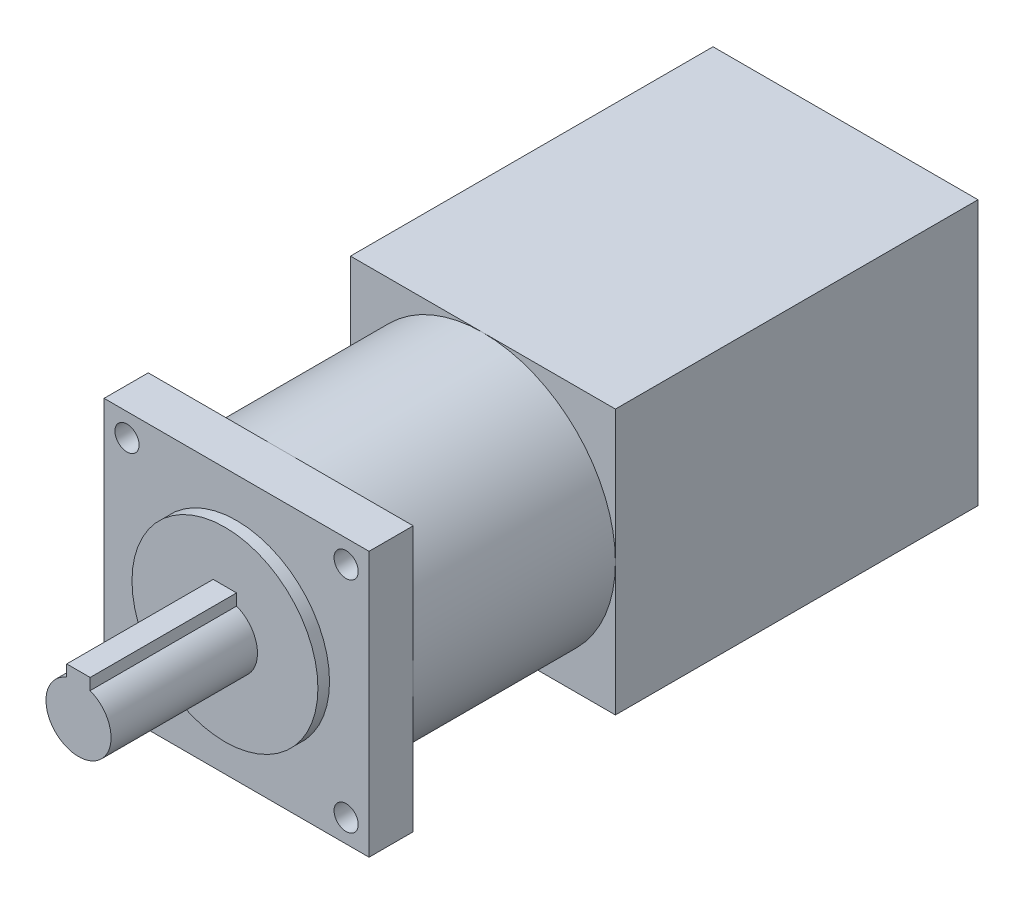
ISO-10303-21;
HEADER;
FILE_DESCRIPTION(('STEP AP214'),'2;1');
FILE_NAME('part.step','',(''),(''),'','','');
FILE_SCHEMA(('AUTOMOTIVE_DESIGN { 1 0 10303 214 1 1 1 1 }'));
ENDSEC;
DATA;
#1=APPLICATION_CONTEXT('core data for automotive mechanical design processes');
#2=APPLICATION_PROTOCOL_DEFINITION('international standard','automotive_design',2000,#1);
#3=PRODUCT_CONTEXT('',#1,'mechanical');
#4=PRODUCT('Part','Part','',(#3));
#5=PRODUCT_RELATED_PRODUCT_CATEGORY('part','',(#4));
#6=PRODUCT_DEFINITION_FORMATION('','',#4);
#7=PRODUCT_DEFINITION_CONTEXT('part definition',#1,'design');
#8=PRODUCT_DEFINITION('design','',#6,#7);
#9=PRODUCT_DEFINITION_SHAPE('','',#8);
#10=(LENGTH_UNIT() NAMED_UNIT(*) SI_UNIT(.MILLI.,.METRE.));
#11=(NAMED_UNIT(*) PLANE_ANGLE_UNIT() SI_UNIT($,.RADIAN.));
#12=(NAMED_UNIT(*) SI_UNIT($,.STERADIAN.) SOLID_ANGLE_UNIT());
#13=UNCERTAINTY_MEASURE_WITH_UNIT(LENGTH_MEASURE(1.E-05),#10,'distance_accuracy_value','');
#14=(GEOMETRIC_REPRESENTATION_CONTEXT(3) GLOBAL_UNCERTAINTY_ASSIGNED_CONTEXT((#13)) GLOBAL_UNIT_ASSIGNED_CONTEXT((#10,
#11,#12)) REPRESENTATION_CONTEXT('',''));
#15=CARTESIAN_POINT('',(0.,0.,0.));
#16=DIRECTION('',(0.,0.,1.));
#17=DIRECTION('',(1.,0.,0.));
#18=AXIS2_PLACEMENT_3D('',#15,#16,#17);
#19=CARTESIAN_POINT('',(0.,0.,131.));
#20=DIRECTION('',(0.,0.,1.));
#21=DIRECTION('',(1.,0.,0.));
#22=AXIS2_PLACEMENT_3D('',#19,#20,#21);
#23=PLANE('',#22);
#24=CARTESIAN_POINT('',(0.,0.,131.));
#25=DIRECTION('',(0.,0.,1.));
#26=DIRECTION('',(1.,0.,0.));
#27=AXIS2_PLACEMENT_3D('',#24,#25,#26);
#28=CIRCLE('',#27,20.);
#29=CARTESIAN_POINT('',(20.,0.,131.));
#30=VERTEX_POINT('',#29);
#31=EDGE_CURVE('E232',#30,#30,#28,.T.);
#32=ORIENTED_EDGE('',*,*,#31,.F.);
#33=EDGE_LOOP('',(#32));
#34=FACE_BOUND('',#33,.T.);
#35=DIRECTION('',(1.,0.,0.));
#36=VECTOR('',#35,1.);
#37=CARTESIAN_POINT('',(28.5,-28.5,131.));
#38=LINE('',#37,#36);
#39=CARTESIAN_POINT('',(-28.5,-28.5,131.));
#40=VERTEX_POINT('',#39);
#41=CARTESIAN_POINT('',(28.5,-28.5,131.));
#42=VERTEX_POINT('',#41);
#43=EDGE_CURVE('E163',#40,#42,#38,.T.);
#44=ORIENTED_EDGE('',*,*,#43,.T.);
#45=DIRECTION('',(0.,1.,0.));
#46=VECTOR('',#45,1.);
#47=CARTESIAN_POINT('',(28.5,-28.5,131.));
#48=LINE('',#47,#46);
#49=CARTESIAN_POINT('',(28.5,28.5,131.));
#50=VERTEX_POINT('',#49);
#51=EDGE_CURVE('E184',#42,#50,#48,.T.);
#52=ORIENTED_EDGE('',*,*,#51,.T.);
#53=DIRECTION('',(-1.,0.,0.));
#54=VECTOR('',#53,1.);
#55=CARTESIAN_POINT('',(28.5,28.5,131.));
#56=LINE('',#55,#54);
#57=CARTESIAN_POINT('',(-28.5,28.5,131.));
#58=VERTEX_POINT('',#57);
#59=EDGE_CURVE('E156',#50,#58,#56,.T.);
#60=ORIENTED_EDGE('',*,*,#59,.T.);
#61=DIRECTION('',(0.,-1.,0.));
#62=VECTOR('',#61,1.);
#63=CARTESIAN_POINT('',(-28.5,-28.5,131.));
#64=LINE('',#63,#62);
#65=EDGE_CURVE('E180',#58,#40,#64,.T.);
#66=ORIENTED_EDGE('',*,*,#65,.T.);
#67=EDGE_LOOP('',(#44,#52,#60,#66));
#68=FACE_BOUND('',#67,.T.);
#69=CARTESIAN_POINT('',(23.5700000000013,-23.5699999999987,131.));
#70=DIRECTION('',(0.,0.,1.));
#71=DIRECTION('',(1.,0.,0.));
#72=AXIS2_PLACEMENT_3D('',#69,#70,#71);
#73=CIRCLE('',#72,2.60000000000186);
#74=CARTESIAN_POINT('',(26.1700000000032,-23.5699999999987,131.));
#75=VERTEX_POINT('',#74);
#76=EDGE_CURVE('E585',#75,#75,#73,.T.);
#77=ORIENTED_EDGE('',*,*,#76,.F.);
#78=EDGE_LOOP('',(#77));
#79=FACE_BOUND('',#78,.T.);
#80=CARTESIAN_POINT('',(-23.5699999999987,-23.57,131.));
#81=DIRECTION('',(0.,0.,1.));
#82=DIRECTION('',(1.,0.,0.));
#83=AXIS2_PLACEMENT_3D('',#80,#81,#82);
#84=CIRCLE('',#83,2.60000000000069);
#85=CARTESIAN_POINT('',(-20.969999999998,-23.57,131.));
#86=VERTEX_POINT('',#85);
#87=EDGE_CURVE('E582',#86,#86,#84,.T.);
#88=ORIENTED_EDGE('',*,*,#87,.F.);
#89=EDGE_LOOP('',(#88));
#90=FACE_BOUND('',#89,.T.);
#91=CARTESIAN_POINT('',(-23.57,23.57,131.));
#92=DIRECTION('',(0.,0.,1.));
#93=DIRECTION('',(1.,0.,0.));
#94=AXIS2_PLACEMENT_3D('',#91,#92,#93);
#95=CIRCLE('',#94,2.6);
#96=CARTESIAN_POINT('',(-20.97,23.57,131.));
#97=VERTEX_POINT('',#96);
#98=EDGE_CURVE('E597',#97,#97,#95,.T.);
#99=ORIENTED_EDGE('',*,*,#98,.F.);
#100=EDGE_LOOP('',(#99));
#101=FACE_BOUND('',#100,.T.);
#102=CARTESIAN_POINT('',(23.57,23.5700000000013,131.));
#103=DIRECTION('',(0.,0.,1.));
#104=DIRECTION('',(1.,0.,0.));
#105=AXIS2_PLACEMENT_3D('',#102,#103,#104);
#106=CIRCLE('',#105,2.60000000000137);
#107=CARTESIAN_POINT('',(26.1700000000014,23.5700000000013,131.));
#108=VERTEX_POINT('',#107);
#109=EDGE_CURVE('E591',#108,#108,#106,.T.);
#110=ORIENTED_EDGE('',*,*,#109,.F.);
#111=EDGE_LOOP('',(#110));
#112=FACE_BOUND('',#111,.T.);
#113=ADVANCED_FACE('F34',(#34,#68,#79,#90,#101,#112),#23,.T.);
#114=CARTESIAN_POINT('',(0.,0.,133.5));
#115=DIRECTION('',(0.,0.,-1.));
#116=DIRECTION('',(-1.,0.,0.));
#117=AXIS2_PLACEMENT_3D('',#114,#115,#116);
#118=CYLINDRICAL_SURFACE('',#117,20.);
#119=CARTESIAN_POINT('',(0.,0.,133.5));
#120=DIRECTION('',(0.,0.,1.));
#121=DIRECTION('',(1.,0.,0.));
#122=AXIS2_PLACEMENT_3D('',#119,#120,#121);
#123=CIRCLE('',#122,20.);
#124=CARTESIAN_POINT('',(20.,0.,133.5));
#125=VERTEX_POINT('',#124);
#126=EDGE_CURVE('E228',#125,#125,#123,.T.);
#127=ORIENTED_EDGE('',*,*,#126,.F.);
#128=EDGE_LOOP('',(#127));
#129=FACE_BOUND('',#128,.T.);
#130=ORIENTED_EDGE('',*,*,#31,.T.);
#131=EDGE_LOOP('',(#130));
#132=FACE_BOUND('',#131,.T.);
#133=ADVANCED_FACE('F322',(#129,#132),#118,.T.);
#134=CARTESIAN_POINT('',(0.,0.,133.5));
#135=DIRECTION('',(0.,0.,1.));
#136=DIRECTION('',(1.,0.,0.));
#137=AXIS2_PLACEMENT_3D('',#134,#135,#136);
#138=PLANE('',#137);
#139=DIRECTION('',(0.,-1.,0.));
#140=VECTOR('',#139,1.);
#141=CARTESIAN_POINT('',(-2.54,9.,133.5));
#142=LINE('',#141,#140);
#143=CARTESIAN_POINT('',(-2.54,9.,133.5));
#144=VERTEX_POINT('',#143);
#145=CARTESIAN_POINT('',(-2.54,6.52291345949032,133.5));
#146=VERTEX_POINT('',#145);
#147=EDGE_CURVE('E190',#144,#146,#142,.T.);
#148=ORIENTED_EDGE('',*,*,#147,.F.);
#149=DIRECTION('',(-1.,0.,0.));
#150=VECTOR('',#149,1.);
#151=CARTESIAN_POINT('',(0.,9.,133.5));
#152=LINE('',#151,#150);
#153=CARTESIAN_POINT('',(2.5,9.,133.5));
#154=VERTEX_POINT('',#153);
#155=EDGE_CURVE('E199',#154,#144,#152,.T.);
#156=ORIENTED_EDGE('',*,*,#155,.F.);
#157=DIRECTION('',(0.,1.,0.));
#158=VECTOR('',#157,1.);
#159=CARTESIAN_POINT('',(2.5,9.,133.5));
#160=LINE('',#159,#158);
#161=CARTESIAN_POINT('',(2.5,6.53834841531101,133.5));
#162=VERTEX_POINT('',#161);
#163=EDGE_CURVE('E212',#162,#154,#160,.T.);
#164=ORIENTED_EDGE('',*,*,#163,.F.);
#165=CARTESIAN_POINT('',(0.,0.,133.5));
#166=DIRECTION('',(0.,0.,1.));
#167=DIRECTION('',(1.,0.,0.));
#168=AXIS2_PLACEMENT_3D('',#165,#166,#167);
#169=CIRCLE('',#168,7.00000000000008);
#170=EDGE_CURVE('E209',#146,#162,#169,.T.);
#171=ORIENTED_EDGE('',*,*,#170,.F.);
#172=EDGE_LOOP('',(#148,#156,#164,#171));
#173=FACE_BOUND('',#172,.T.);
#174=ORIENTED_EDGE('',*,*,#126,.T.);
#175=EDGE_LOOP('',(#174));
#176=FACE_BOUND('',#175,.T.);
#177=ADVANCED_FACE('F328',(#173,#176),#138,.T.);
#178=CARTESIAN_POINT('',(-2.54,9.,165.));
#179=DIRECTION('',(1.,0.,0.));
#180=DIRECTION('',(0.,0.,-1.));
#181=AXIS2_PLACEMENT_3D('',#178,#179,#180);
#182=PLANE('',#181);
#183=ORIENTED_EDGE('',*,*,#147,.T.);
#184=DIRECTION('',(0.,0.,-1.));
#185=VECTOR('',#184,1.);
#186=CARTESIAN_POINT('',(-2.54,6.52291345949032,165.));
#187=LINE('',#186,#185);
#188=CARTESIAN_POINT('',(-2.54,6.52291345949032,165.));
#189=VERTEX_POINT('',#188);
#190=EDGE_CURVE('E222',#189,#146,#187,.T.);
#191=ORIENTED_EDGE('',*,*,#190,.F.);
#192=DIRECTION('',(0.,-1.,0.));
#193=VECTOR('',#192,1.);
#194=CARTESIAN_POINT('',(-2.54,9.,165.));
#195=LINE('',#194,#193);
#196=CARTESIAN_POINT('',(-2.54,9.,165.));
#197=VERTEX_POINT('',#196);
#198=EDGE_CURVE('E198',#197,#189,#195,.T.);
#199=ORIENTED_EDGE('',*,*,#198,.F.);
#200=DIRECTION('',(0.,0.,-1.));
#201=VECTOR('',#200,1.);
#202=CARTESIAN_POINT('',(-2.54,9.,165.));
#203=LINE('',#202,#201);
#204=EDGE_CURVE('E225',#197,#144,#203,.T.);
#205=ORIENTED_EDGE('',*,*,#204,.T.);
#206=EDGE_LOOP('',(#183,#191,#199,#205));
#207=FACE_BOUND('',#206,.T.);
#208=ADVANCED_FACE('F403',(#207),#182,.F.);
#209=CARTESIAN_POINT('',(0.,0.,165.));
#210=DIRECTION('',(0.,0.,-1.));
#211=DIRECTION('',(-1.,0.,0.));
#212=AXIS2_PLACEMENT_3D('',#209,#210,#211);
#213=CYLINDRICAL_SURFACE('',#212,7.00000000000008);
#214=ORIENTED_EDGE('',*,*,#170,.T.);
#215=DIRECTION('',(0.,0.,-1.));
#216=VECTOR('',#215,1.);
#217=CARTESIAN_POINT('',(2.5,6.53834841531101,165.));
#218=LINE('',#217,#216);
#219=CARTESIAN_POINT('',(2.5,6.53834841531101,165.));
#220=VERTEX_POINT('',#219);
#221=EDGE_CURVE('E219',#220,#162,#218,.T.);
#222=ORIENTED_EDGE('',*,*,#221,.F.);
#223=CARTESIAN_POINT('',(0.,0.,165.));
#224=DIRECTION('',(0.,0.,1.));
#225=DIRECTION('',(1.,0.,0.));
#226=AXIS2_PLACEMENT_3D('',#223,#224,#225);
#227=CIRCLE('',#226,7.00000000000008);
#228=EDGE_CURVE('E201',#189,#220,#227,.T.);
#229=ORIENTED_EDGE('',*,*,#228,.F.);
#230=ORIENTED_EDGE('',*,*,#190,.T.);
#231=EDGE_LOOP('',(#214,#222,#229,#230));
#232=FACE_BOUND('',#231,.T.);
#233=ADVANCED_FACE('F412',(#232),#213,.T.);
#234=CARTESIAN_POINT('',(2.5,9.,165.));
#235=DIRECTION('',(-1.,0.,0.));
#236=DIRECTION('',(0.,0.,1.));
#237=AXIS2_PLACEMENT_3D('',#234,#235,#236);
#238=PLANE('',#237);
#239=ORIENTED_EDGE('',*,*,#163,.T.);
#240=DIRECTION('',(0.,0.,-1.));
#241=VECTOR('',#240,1.);
#242=CARTESIAN_POINT('',(2.5,9.,165.));
#243=LINE('',#242,#241);
#244=CARTESIAN_POINT('',(2.5,9.,165.));
#245=VERTEX_POINT('',#244);
#246=EDGE_CURVE('E206',#245,#154,#243,.T.);
#247=ORIENTED_EDGE('',*,*,#246,.F.);
#248=DIRECTION('',(0.,1.,0.));
#249=VECTOR('',#248,1.);
#250=CARTESIAN_POINT('',(2.5,9.,165.));
#251=LINE('',#250,#249);
#252=EDGE_CURVE('E203',#220,#245,#251,.T.);
#253=ORIENTED_EDGE('',*,*,#252,.F.);
#254=ORIENTED_EDGE('',*,*,#221,.T.);
#255=EDGE_LOOP('',(#239,#247,#253,#254));
#256=FACE_BOUND('',#255,.T.);
#257=ADVANCED_FACE('F422',(#256),#238,.F.);
#258=CARTESIAN_POINT('',(0.,9.,165.));
#259=DIRECTION('',(0.,-1.,0.));
#260=DIRECTION('',(0.,0.,-1.));
#261=AXIS2_PLACEMENT_3D('',#258,#259,#260);
#262=PLANE('',#261);
#263=ORIENTED_EDGE('',*,*,#155,.T.);
#264=ORIENTED_EDGE('',*,*,#204,.F.);
#265=DIRECTION('',(-1.,0.,0.));
#266=VECTOR('',#265,1.);
#267=CARTESIAN_POINT('',(0.,9.,165.));
#268=LINE('',#267,#266);
#269=EDGE_CURVE('E195',#245,#197,#268,.T.);
#270=ORIENTED_EDGE('',*,*,#269,.F.);
#271=ORIENTED_EDGE('',*,*,#246,.T.);
#272=EDGE_LOOP('',(#263,#264,#270,#271));
#273=FACE_BOUND('',#272,.T.);
#274=ADVANCED_FACE('F432',(#273),#262,.F.);
#275=CARTESIAN_POINT('',(0.,0.,165.));
#276=DIRECTION('',(0.,0.,1.));
#277=DIRECTION('',(1.,0.,0.));
#278=AXIS2_PLACEMENT_3D('',#275,#276,#277);
#279=PLANE('',#278);
#280=ORIENTED_EDGE('',*,*,#269,.T.);
#281=ORIENTED_EDGE('',*,*,#198,.T.);
#282=ORIENTED_EDGE('',*,*,#228,.T.);
#283=ORIENTED_EDGE('',*,*,#252,.T.);
#284=EDGE_LOOP('',(#280,#281,#282,#283));
#285=FACE_BOUND('',#284,.T.);
#286=ADVANCED_FACE('F443',(#285),#279,.T.);
#287=CARTESIAN_POINT('',(0.,0.,121.5));
#288=DIRECTION('',(0.,0.,1.));
#289=DIRECTION('',(1.,0.,0.));
#290=AXIS2_PLACEMENT_3D('',#287,#288,#289);
#291=PLANE('',#290);
#292=CARTESIAN_POINT('',(23.57,23.5700000000013,121.5));
#293=DIRECTION('',(0.,0.,1.));
#294=DIRECTION('',(1.,0.,0.));
#295=AXIS2_PLACEMENT_3D('',#292,#293,#294);
#296=CIRCLE('',#295,2.60000000000137);
#297=CARTESIAN_POINT('',(26.1700000000014,23.5700000000013,121.5));
#298=VERTEX_POINT('',#297);
#299=EDGE_CURVE('E594',#298,#298,#296,.T.);
#300=ORIENTED_EDGE('',*,*,#299,.T.);
#301=EDGE_LOOP('',(#300));
#302=FACE_BOUND('',#301,.T.);
#303=DIRECTION('',(0.,1.,0.));
#304=VECTOR('',#303,1.);
#305=CARTESIAN_POINT('',(28.5,-28.5,121.5));
#306=LINE('',#305,#304);
#307=CARTESIAN_POINT('',(28.5,0.,121.5));
#308=VERTEX_POINT('',#307);
#309=CARTESIAN_POINT('',(28.5,28.5,121.5));
#310=VERTEX_POINT('',#309);
#311=EDGE_CURVE('E169',#308,#310,#306,.T.);
#312=ORIENTED_EDGE('',*,*,#311,.F.);
#313=CARTESIAN_POINT('',(0.,0.,121.5));
#314=DIRECTION('',(0.,0.,1.));
#315=DIRECTION('',(1.,0.,0.));
#316=AXIS2_PLACEMENT_3D('',#313,#314,#315);
#317=CIRCLE('',#316,28.5);
#318=CARTESIAN_POINT('',(0.,28.5,121.5));
#319=VERTEX_POINT('',#318);
#320=EDGE_CURVE('E11',#308,#319,#317,.T.);
#321=ORIENTED_EDGE('',*,*,#320,.T.);
#322=DIRECTION('',(-1.,0.,0.));
#323=VECTOR('',#322,1.);
#324=CARTESIAN_POINT('',(28.5,28.5,121.5));
#325=LINE('',#324,#323);
#326=EDGE_CURVE('E165',#310,#319,#325,.T.);
#327=ORIENTED_EDGE('',*,*,#326,.F.);
#328=EDGE_LOOP('',(#312,#321,#327));
#329=FACE_BOUND('',#328,.T.);
#330=ADVANCED_FACE('F452',(#302,#329),#291,.F.);
#331=CARTESIAN_POINT('',(-23.57,23.57,121.5));
#332=DIRECTION('',(0.,0.,1.));
#333=DIRECTION('',(1.,0.,0.));
#334=AXIS2_PLACEMENT_3D('',#331,#332,#333);
#335=CIRCLE('',#334,2.6);
#336=CARTESIAN_POINT('',(-20.97,23.57,121.5));
#337=VERTEX_POINT('',#336);
#338=EDGE_CURVE('E182',#337,#337,#335,.T.);
#339=ORIENTED_EDGE('',*,*,#338,.T.);
#340=EDGE_LOOP('',(#339));
#341=FACE_BOUND('',#340,.T.);
#342=CARTESIAN_POINT('',(-28.5,28.5,121.5));
#343=VERTEX_POINT('',#342);
#344=EDGE_CURVE('E177',#319,#343,#325,.T.);
#345=ORIENTED_EDGE('',*,*,#344,.F.);
#346=CARTESIAN_POINT('',(-28.5,0.,121.5));
#347=VERTEX_POINT('',#346);
#348=EDGE_CURVE('E43',#319,#347,#317,.T.);
#349=ORIENTED_EDGE('',*,*,#348,.T.);
#350=DIRECTION('',(0.,-1.,0.));
#351=VECTOR('',#350,1.);
#352=CARTESIAN_POINT('',(-28.5,-28.5,121.5));
#353=LINE('',#352,#351);
#354=EDGE_CURVE('E153',#343,#347,#353,.T.);
#355=ORIENTED_EDGE('',*,*,#354,.F.);
#356=EDGE_LOOP('',(#345,#349,#355));
#357=FACE_BOUND('',#356,.T.);
#358=ADVANCED_FACE('F467',(#341,#357),#291,.F.);
#359=CARTESIAN_POINT('',(-23.5699999999987,-23.57,121.5));
#360=DIRECTION('',(0.,0.,1.));
#361=DIRECTION('',(1.,0.,0.));
#362=AXIS2_PLACEMENT_3D('',#359,#360,#361);
#363=CIRCLE('',#362,2.60000000000069);
#364=CARTESIAN_POINT('',(-20.969999999998,-23.57,121.5));
#365=VERTEX_POINT('',#364);
#366=EDGE_CURVE('E579',#365,#365,#363,.T.);
#367=ORIENTED_EDGE('',*,*,#366,.T.);
#368=EDGE_LOOP('',(#367));
#369=FACE_BOUND('',#368,.T.);
#370=CARTESIAN_POINT('',(-28.5,-28.5,121.5));
#371=VERTEX_POINT('',#370);
#372=EDGE_CURVE('E145',#347,#371,#353,.T.);
#373=ORIENTED_EDGE('',*,*,#372,.F.);
#374=CARTESIAN_POINT('',(0.,-28.5,121.5));
#375=VERTEX_POINT('',#374);
#376=EDGE_CURVE('E53',#347,#375,#317,.T.);
#377=ORIENTED_EDGE('',*,*,#376,.T.);
#378=DIRECTION('',(1.,0.,0.));
#379=VECTOR('',#378,1.);
#380=CARTESIAN_POINT('',(28.5,-28.5,121.5));
#381=LINE('',#380,#379);
#382=EDGE_CURVE('E161',#371,#375,#381,.T.);
#383=ORIENTED_EDGE('',*,*,#382,.F.);
#384=EDGE_LOOP('',(#373,#377,#383));
#385=FACE_BOUND('',#384,.T.);
#386=ADVANCED_FACE('F167',(#369,#385),#291,.F.);
#387=CARTESIAN_POINT('',(-28.5,-28.5,121.5));
#388=DIRECTION('',(-1.,0.,0.));
#389=DIRECTION('',(0.,0.,1.));
#390=AXIS2_PLACEMENT_3D('',#387,#388,#389);
#391=PLANE('',#390);
#392=ORIENTED_EDGE('',*,*,#354,.T.);
#393=ORIENTED_EDGE('',*,*,#372,.T.);
#394=DIRECTION('',(0.,0.,1.));
#395=VECTOR('',#394,1.);
#396=CARTESIAN_POINT('',(-28.5,-28.5,121.5));
#397=LINE('',#396,#395);
#398=EDGE_CURVE('E149',#371,#40,#397,.T.);
#399=ORIENTED_EDGE('',*,*,#398,.T.);
#400=ORIENTED_EDGE('',*,*,#65,.F.);
#401=DIRECTION('',(0.,0.,1.));
#402=VECTOR('',#401,1.);
#403=CARTESIAN_POINT('',(-28.5,28.5,121.5));
#404=LINE('',#403,#402);
#405=EDGE_CURVE('E187',#343,#58,#404,.T.);
#406=ORIENTED_EDGE('',*,*,#405,.F.);
#407=EDGE_LOOP('',(#392,#393,#399,#400,#406));
#408=FACE_BOUND('',#407,.T.);
#409=ADVANCED_FACE('F147',(#408),#391,.T.);
#410=CARTESIAN_POINT('',(28.5,28.5,121.5));
#411=DIRECTION('',(0.,1.,0.));
#412=DIRECTION('',(-1.,0.,0.));
#413=AXIS2_PLACEMENT_3D('',#410,#411,#412);
#414=PLANE('',#413);
#415=ORIENTED_EDGE('',*,*,#326,.T.);
#416=ORIENTED_EDGE('',*,*,#344,.T.);
#417=ORIENTED_EDGE('',*,*,#405,.T.);
#418=ORIENTED_EDGE('',*,*,#59,.F.);
#419=DIRECTION('',(0.,0.,1.));
#420=VECTOR('',#419,1.);
#421=CARTESIAN_POINT('',(28.5,28.5,121.5));
#422=LINE('',#421,#420);
#423=EDGE_CURVE('E191',#310,#50,#422,.T.);
#424=ORIENTED_EDGE('',*,*,#423,.F.);
#425=EDGE_LOOP('',(#415,#416,#417,#418,#424));
#426=FACE_BOUND('',#425,.T.);
#427=ADVANCED_FACE('F494',(#426),#414,.T.);
#428=CARTESIAN_POINT('',(28.5,-28.5,121.5));
#429=DIRECTION('',(1.,0.,0.));
#430=DIRECTION('',(0.,0.,-1.));
#431=AXIS2_PLACEMENT_3D('',#428,#429,#430);
#432=PLANE('',#431);
#433=CARTESIAN_POINT('',(28.5,-28.5,121.5));
#434=VERTEX_POINT('',#433);
#435=EDGE_CURVE('E172',#434,#308,#306,.T.);
#436=ORIENTED_EDGE('',*,*,#435,.T.);
#437=ORIENTED_EDGE('',*,*,#311,.T.);
#438=ORIENTED_EDGE('',*,*,#423,.T.);
#439=ORIENTED_EDGE('',*,*,#51,.F.);
#440=DIRECTION('',(0.,0.,1.));
#441=VECTOR('',#440,1.);
#442=CARTESIAN_POINT('',(28.5,-28.5,121.5));
#443=LINE('',#442,#441);
#444=EDGE_CURVE('E164',#434,#42,#443,.T.);
#445=ORIENTED_EDGE('',*,*,#444,.F.);
#446=EDGE_LOOP('',(#436,#437,#438,#439,#445));
#447=FACE_BOUND('',#446,.T.);
#448=ADVANCED_FACE('F503',(#447),#432,.T.);
#449=CARTESIAN_POINT('',(28.5,-28.5,121.5));
#450=DIRECTION('',(0.,-1.,0.));
#451=DIRECTION('',(1.,0.,0.));
#452=AXIS2_PLACEMENT_3D('',#449,#450,#451);
#453=PLANE('',#452);
#454=ORIENTED_EDGE('',*,*,#382,.T.);
#455=EDGE_CURVE('E170',#375,#434,#381,.T.);
#456=ORIENTED_EDGE('',*,*,#455,.T.);
#457=ORIENTED_EDGE('',*,*,#444,.T.);
#458=ORIENTED_EDGE('',*,*,#43,.F.);
#459=ORIENTED_EDGE('',*,*,#398,.F.);
#460=EDGE_LOOP('',(#454,#456,#457,#458,#459));
#461=FACE_BOUND('',#460,.T.);
#462=ADVANCED_FACE('F160',(#461),#453,.T.);
#463=CARTESIAN_POINT('',(23.5700000000013,-23.5699999999987,121.5));
#464=DIRECTION('',(0.,0.,1.));
#465=DIRECTION('',(1.,0.,0.));
#466=AXIS2_PLACEMENT_3D('',#463,#464,#465);
#467=CIRCLE('',#466,2.60000000000186);
#468=CARTESIAN_POINT('',(26.1700000000032,-23.5699999999987,121.5));
#469=VERTEX_POINT('',#468);
#470=EDGE_CURVE('E588',#469,#469,#467,.T.);
#471=ORIENTED_EDGE('',*,*,#470,.T.);
#472=EDGE_LOOP('',(#471));
#473=FACE_BOUND('',#472,.T.);
#474=ORIENTED_EDGE('',*,*,#455,.F.);
#475=EDGE_CURVE('E38',#375,#308,#317,.T.);
#476=ORIENTED_EDGE('',*,*,#475,.T.);
#477=ORIENTED_EDGE('',*,*,#435,.F.);
#478=EDGE_LOOP('',(#474,#476,#477));
#479=FACE_BOUND('',#478,.T.);
#480=ADVANCED_FACE('F470',(#473,#479),#291,.F.);
#481=CARTESIAN_POINT('',(-23.57,23.57,121.5));
#482=DIRECTION('',(0.,0.,1.));
#483=DIRECTION('',(1.,0.,0.));
#484=AXIS2_PLACEMENT_3D('',#481,#482,#483);
#485=CYLINDRICAL_SURFACE('',#484,2.6);
#486=ORIENTED_EDGE('',*,*,#338,.F.);
#487=EDGE_LOOP('',(#486));
#488=FACE_BOUND('',#487,.T.);
#489=ORIENTED_EDGE('',*,*,#98,.T.);
#490=EDGE_LOOP('',(#489));
#491=FACE_BOUND('',#490,.T.);
#492=ADVANCED_FACE('F530',(#488,#491),#485,.F.);
#493=CARTESIAN_POINT('',(23.57,23.5700000000013,121.5));
#494=DIRECTION('',(0.,0.,1.));
#495=DIRECTION('',(1.,0.,0.));
#496=AXIS2_PLACEMENT_3D('',#493,#494,#495);
#497=CYLINDRICAL_SURFACE('',#496,2.60000000000137);
#498=ORIENTED_EDGE('',*,*,#299,.F.);
#499=EDGE_LOOP('',(#498));
#500=FACE_BOUND('',#499,.T.);
#501=ORIENTED_EDGE('',*,*,#109,.T.);
#502=EDGE_LOOP('',(#501));
#503=FACE_BOUND('',#502,.T.);
#504=ADVANCED_FACE('F539',(#500,#503),#497,.F.);
#505=CARTESIAN_POINT('',(23.5700000000013,-23.5699999999987,121.5));
#506=DIRECTION('',(0.,0.,1.));
#507=DIRECTION('',(1.,0.,0.));
#508=AXIS2_PLACEMENT_3D('',#505,#506,#507);
#509=CYLINDRICAL_SURFACE('',#508,2.60000000000186);
#510=ORIENTED_EDGE('',*,*,#470,.F.);
#511=EDGE_LOOP('',(#510));
#512=FACE_BOUND('',#511,.T.);
#513=ORIENTED_EDGE('',*,*,#76,.T.);
#514=EDGE_LOOP('',(#513));
#515=FACE_BOUND('',#514,.T.);
#516=ADVANCED_FACE('F549',(#512,#515),#509,.F.);
#517=CARTESIAN_POINT('',(-23.5699999999987,-23.57,121.5));
#518=DIRECTION('',(0.,0.,1.));
#519=DIRECTION('',(1.,0.,0.));
#520=AXIS2_PLACEMENT_3D('',#517,#518,#519);
#521=CYLINDRICAL_SURFACE('',#520,2.60000000000069);
#522=ORIENTED_EDGE('',*,*,#366,.F.);
#523=EDGE_LOOP('',(#522));
#524=FACE_BOUND('',#523,.T.);
#525=ORIENTED_EDGE('',*,*,#87,.T.);
#526=EDGE_LOOP('',(#525));
#527=FACE_BOUND('',#526,.T.);
#528=ADVANCED_FACE('F558',(#524,#527),#521,.F.);
#529=CARTESIAN_POINT('',(0.,0.,0.));
#530=DIRECTION('',(0.,0.,1.));
#531=DIRECTION('',(1.,0.,0.));
#532=AXIS2_PLACEMENT_3D('',#529,#530,#531);
#533=PLANE('',#532);
#534=DIRECTION('',(0.,1.,0.));
#535=VECTOR('',#534,1.);
#536=CARTESIAN_POINT('',(28.5,28.5,0.));
#537=LINE('',#536,#535);
#538=CARTESIAN_POINT('',(28.5,-28.5,0.));
#539=VERTEX_POINT('',#538);
#540=CARTESIAN_POINT('',(28.5,28.5,0.));
#541=VERTEX_POINT('',#540);
#542=EDGE_CURVE('E238',#539,#541,#537,.T.);
#543=ORIENTED_EDGE('',*,*,#542,.F.);
#544=DIRECTION('',(1.,0.,0.));
#545=VECTOR('',#544,1.);
#546=CARTESIAN_POINT('',(-28.5,-28.5,0.));
#547=LINE('',#546,#545);
#548=CARTESIAN_POINT('',(-28.5,-28.5,0.));
#549=VERTEX_POINT('',#548);
#550=EDGE_CURVE('E262',#549,#539,#547,.T.);
#551=ORIENTED_EDGE('',*,*,#550,.F.);
#552=DIRECTION('',(0.,-1.,0.));
#553=VECTOR('',#552,1.);
#554=CARTESIAN_POINT('',(-28.5,28.5,0.));
#555=LINE('',#554,#553);
#556=CARTESIAN_POINT('',(-28.5,28.5,0.));
#557=VERTEX_POINT('',#556);
#558=EDGE_CURVE('E260',#557,#549,#555,.T.);
#559=ORIENTED_EDGE('',*,*,#558,.F.);
#560=DIRECTION('',(-1.,0.,0.));
#561=VECTOR('',#560,1.);
#562=CARTESIAN_POINT('',(-28.5,28.5,0.));
#563=LINE('',#562,#561);
#564=EDGE_CURVE('E258',#541,#557,#563,.T.);
#565=ORIENTED_EDGE('',*,*,#564,.F.);
#566=EDGE_LOOP('',(#543,#551,#559,#565));
#567=FACE_BOUND('',#566,.T.);
#568=ADVANCED_FACE('F298',(#567),#533,.F.);
#569=CARTESIAN_POINT('',(-28.5,-28.5,78.));
#570=DIRECTION('',(0.,1.,0.));
#571=DIRECTION('',(0.,0.,1.));
#572=AXIS2_PLACEMENT_3D('',#569,#570,#571);
#573=PLANE('',#572);
#574=ORIENTED_EDGE('',*,*,#550,.T.);
#575=DIRECTION('',(0.,0.,-1.));
#576=VECTOR('',#575,1.);
#577=CARTESIAN_POINT('',(28.5,-28.5,78.));
#578=LINE('',#577,#576);
#579=CARTESIAN_POINT('',(28.5,-28.5,78.));
#580=VERTEX_POINT('',#579);
#581=EDGE_CURVE('E255',#580,#539,#578,.T.);
#582=ORIENTED_EDGE('',*,*,#581,.F.);
#583=DIRECTION('',(1.,0.,0.));
#584=VECTOR('',#583,1.);
#585=CARTESIAN_POINT('',(-28.5,-28.5,78.));
#586=LINE('',#585,#584);
#587=CARTESIAN_POINT('',(0.,-28.5,78.));
#588=VERTEX_POINT('',#587);
#589=EDGE_CURVE('E251',#588,#580,#586,.T.);
#590=ORIENTED_EDGE('',*,*,#589,.F.);
#591=CARTESIAN_POINT('',(-28.5,-28.5,78.));
#592=VERTEX_POINT('',#591);
#593=EDGE_CURVE('E252',#592,#588,#586,.T.);
#594=ORIENTED_EDGE('',*,*,#593,.F.);
#595=DIRECTION('',(0.,0.,-1.));
#596=VECTOR('',#595,1.);
#597=CARTESIAN_POINT('',(-28.5,-28.5,78.));
#598=LINE('',#597,#596);
#599=EDGE_CURVE('E266',#592,#549,#598,.T.);
#600=ORIENTED_EDGE('',*,*,#599,.T.);
#601=EDGE_LOOP('',(#574,#582,#590,#594,#600));
#602=FACE_BOUND('',#601,.T.);
#603=ADVANCED_FACE('F309',(#602),#573,.F.);
#604=CARTESIAN_POINT('',(-28.5,28.5,78.));
#605=DIRECTION('',(1.,0.,0.));
#606=DIRECTION('',(0.,1.,0.));
#607=AXIS2_PLACEMENT_3D('',#604,#605,#606);
#608=PLANE('',#607);
#609=ORIENTED_EDGE('',*,*,#558,.T.);
#610=ORIENTED_EDGE('',*,*,#599,.F.);
#611=DIRECTION('',(0.,-1.,0.));
#612=VECTOR('',#611,1.);
#613=CARTESIAN_POINT('',(-28.5,28.5,78.));
#614=LINE('',#613,#612);
#615=CARTESIAN_POINT('',(-28.5,0.,78.));
#616=VERTEX_POINT('',#615);
#617=EDGE_CURVE('E247',#616,#592,#614,.T.);
#618=ORIENTED_EDGE('',*,*,#617,.F.);
#619=CARTESIAN_POINT('',(-28.5,28.5,78.));
#620=VERTEX_POINT('',#619);
#621=EDGE_CURVE('E248',#620,#616,#614,.T.);
#622=ORIENTED_EDGE('',*,*,#621,.F.);
#623=DIRECTION('',(0.,0.,-1.));
#624=VECTOR('',#623,1.);
#625=CARTESIAN_POINT('',(-28.5,28.5,78.));
#626=LINE('',#625,#624);
#627=EDGE_CURVE('E269',#620,#557,#626,.T.);
#628=ORIENTED_EDGE('',*,*,#627,.T.);
#629=EDGE_LOOP('',(#609,#610,#618,#622,#628));
#630=FACE_BOUND('',#629,.T.);
#631=ADVANCED_FACE('F301',(#630),#608,.F.);
#632=CARTESIAN_POINT('',(-28.5,28.5,78.));
#633=DIRECTION('',(0.,-1.,0.));
#634=DIRECTION('',(0.,0.,-1.));
#635=AXIS2_PLACEMENT_3D('',#632,#633,#634);
#636=PLANE('',#635);
#637=ORIENTED_EDGE('',*,*,#564,.T.);
#638=ORIENTED_EDGE('',*,*,#627,.F.);
#639=DIRECTION('',(-1.,0.,0.));
#640=VECTOR('',#639,1.);
#641=CARTESIAN_POINT('',(-28.5,28.5,78.));
#642=LINE('',#641,#640);
#643=CARTESIAN_POINT('',(0.,28.5,78.));
#644=VERTEX_POINT('',#643);
#645=EDGE_CURVE('E242',#644,#620,#642,.T.);
#646=ORIENTED_EDGE('',*,*,#645,.F.);
#647=CARTESIAN_POINT('',(28.5,28.5,78.));
#648=VERTEX_POINT('',#647);
#649=EDGE_CURVE('E244',#648,#644,#642,.T.);
#650=ORIENTED_EDGE('',*,*,#649,.F.);
#651=DIRECTION('',(0.,0.,-1.));
#652=VECTOR('',#651,1.);
#653=CARTESIAN_POINT('',(28.5,28.5,78.));
#654=LINE('',#653,#652);
#655=EDGE_CURVE('E271',#648,#541,#654,.T.);
#656=ORIENTED_EDGE('',*,*,#655,.T.);
#657=EDGE_LOOP('',(#637,#638,#646,#650,#656));
#658=FACE_BOUND('',#657,.T.);
#659=ADVANCED_FACE('F288',(#658),#636,.F.);
#660=CARTESIAN_POINT('',(28.5,28.5,78.));
#661=DIRECTION('',(-1.,0.,0.));
#662=DIRECTION('',(0.,-1.,0.));
#663=AXIS2_PLACEMENT_3D('',#660,#661,#662);
#664=PLANE('',#663);
#665=ORIENTED_EDGE('',*,*,#542,.T.);
#666=ORIENTED_EDGE('',*,*,#655,.F.);
#667=DIRECTION('',(0.,1.,0.));
#668=VECTOR('',#667,1.);
#669=CARTESIAN_POINT('',(28.5,28.5,78.));
#670=LINE('',#669,#668);
#671=CARTESIAN_POINT('',(28.5,0.,78.));
#672=VERTEX_POINT('',#671);
#673=EDGE_CURVE('E243',#672,#648,#670,.T.);
#674=ORIENTED_EDGE('',*,*,#673,.F.);
#675=EDGE_CURVE('E240',#580,#672,#670,.T.);
#676=ORIENTED_EDGE('',*,*,#675,.F.);
#677=ORIENTED_EDGE('',*,*,#581,.T.);
#678=EDGE_LOOP('',(#665,#666,#674,#676,#677));
#679=FACE_BOUND('',#678,.T.);
#680=ADVANCED_FACE('F36',(#679),#664,.F.);
#681=CARTESIAN_POINT('',(0.,0.,78.));
#682=DIRECTION('',(0.,0.,1.));
#683=DIRECTION('',(1.,0.,0.));
#684=AXIS2_PLACEMENT_3D('',#681,#682,#683);
#685=PLANE('',#684);
#686=CARTESIAN_POINT('',(0.,0.,78.));
#687=DIRECTION('',(0.,0.,1.));
#688=DIRECTION('',(1.,0.,0.));
#689=AXIS2_PLACEMENT_3D('',#686,#687,#688);
#690=CIRCLE('',#689,28.5);
#691=EDGE_CURVE('E239',#588,#672,#690,.T.);
#692=ORIENTED_EDGE('',*,*,#691,.F.);
#693=ORIENTED_EDGE('',*,*,#589,.T.);
#694=ORIENTED_EDGE('',*,*,#675,.T.);
#695=EDGE_LOOP('',(#692,#693,#694));
#696=FACE_BOUND('',#695,.T.);
#697=ADVANCED_FACE('F311',(#696),#685,.T.);
#698=EDGE_CURVE('E277',#616,#588,#690,.T.);
#699=ORIENTED_EDGE('',*,*,#698,.F.);
#700=ORIENTED_EDGE('',*,*,#617,.T.);
#701=ORIENTED_EDGE('',*,*,#593,.T.);
#702=EDGE_LOOP('',(#699,#700,#701));
#703=FACE_BOUND('',#702,.T.);
#704=ADVANCED_FACE('F306',(#703),#685,.T.);
#705=EDGE_CURVE('E235',#644,#616,#690,.T.);
#706=ORIENTED_EDGE('',*,*,#705,.F.);
#707=ORIENTED_EDGE('',*,*,#645,.T.);
#708=ORIENTED_EDGE('',*,*,#621,.T.);
#709=EDGE_LOOP('',(#706,#707,#708));
#710=FACE_BOUND('',#709,.T.);
#711=ADVANCED_FACE('F285',(#710),#685,.T.);
#712=EDGE_CURVE('E231',#672,#644,#690,.T.);
#713=ORIENTED_EDGE('',*,*,#712,.F.);
#714=ORIENTED_EDGE('',*,*,#673,.T.);
#715=ORIENTED_EDGE('',*,*,#649,.T.);
#716=EDGE_LOOP('',(#713,#714,#715));
#717=FACE_BOUND('',#716,.T.);
#718=ADVANCED_FACE('F290',(#717),#685,.T.);
#719=CARTESIAN_POINT('',(0.,0.,131.));
#720=DIRECTION('',(0.,0.,-1.));
#721=DIRECTION('',(-1.,0.,0.));
#722=AXIS2_PLACEMENT_3D('',#719,#720,#721);
#723=CYLINDRICAL_SURFACE('',#722,28.5);
#724=ORIENTED_EDGE('',*,*,#712,.T.);
#725=ORIENTED_EDGE('',*,*,#705,.T.);
#726=ORIENTED_EDGE('',*,*,#698,.T.);
#727=ORIENTED_EDGE('',*,*,#691,.T.);
#728=EDGE_LOOP('',(#724,#725,#726,#727));
#729=FACE_BOUND('',#728,.T.);
#730=ORIENTED_EDGE('',*,*,#320,.F.);
#731=ORIENTED_EDGE('',*,*,#475,.F.);
#732=ORIENTED_EDGE('',*,*,#376,.F.);
#733=ORIENTED_EDGE('',*,*,#348,.F.);
#734=EDGE_LOOP('',(#730,#731,#732,#733));
#735=FACE_BOUND('',#734,.T.);
#736=ADVANCED_FACE('F281',(#729,#735),#723,.T.);
#737=CLOSED_SHELL('',(#113,#133,#177,#208,#233,#257,#274,#286,#330,#358,#386,#409,#427,#448,
#462,#480,#492,#504,#516,#528,#568,#603,#631,#659,#680,#697,#704,#711,#718,#736));
#738=MANIFOLD_SOLID_BREP('B2',#737);
#739=ADVANCED_BREP_SHAPE_REPRESENTATION('',(#18,#738),#14);
#740=SHAPE_DEFINITION_REPRESENTATION(#9,#739);
ENDSEC;
END-ISO-10303-21;
